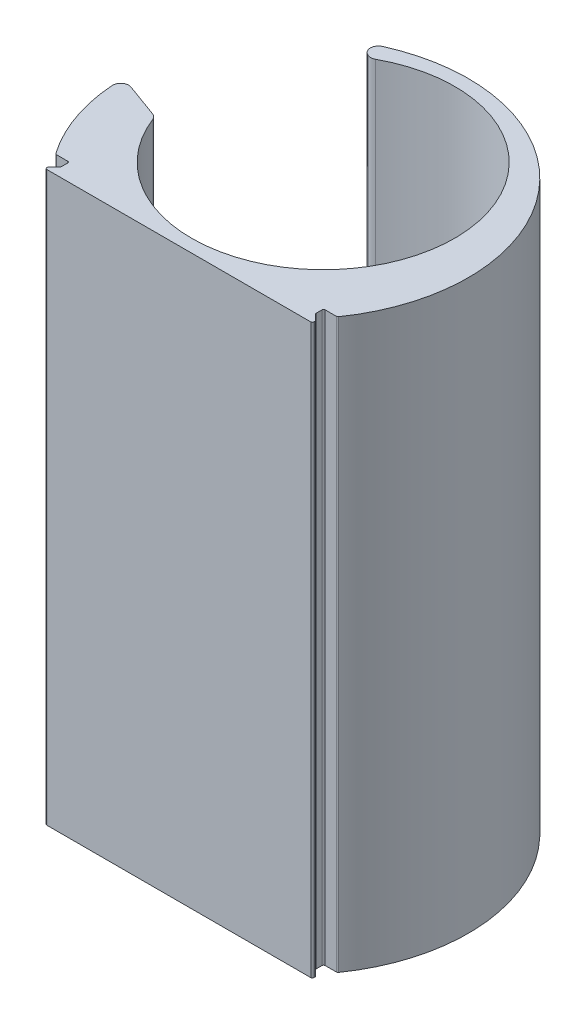
ISO-10303-21;
HEADER;
FILE_DESCRIPTION(('STEP AP214'),'2;1');
FILE_NAME('part.step','',(''),(''),'','','');
FILE_SCHEMA(('AUTOMOTIVE_DESIGN { 1 0 10303 214 1 1 1 1 }'));
ENDSEC;
DATA;
#1=APPLICATION_CONTEXT('core data for automotive mechanical design processes');
#2=APPLICATION_PROTOCOL_DEFINITION('international standard','automotive_design',2000,#1);
#3=PRODUCT_CONTEXT('',#1,'mechanical');
#4=PRODUCT('Part','Part','',(#3));
#5=PRODUCT_RELATED_PRODUCT_CATEGORY('part','',(#4));
#6=PRODUCT_DEFINITION_FORMATION('','',#4);
#7=PRODUCT_DEFINITION_CONTEXT('part definition',#1,'design');
#8=PRODUCT_DEFINITION('design','',#6,#7);
#9=PRODUCT_DEFINITION_SHAPE('','',#8);
#10=(LENGTH_UNIT() NAMED_UNIT(*) SI_UNIT(.MILLI.,.METRE.));
#11=(NAMED_UNIT(*) PLANE_ANGLE_UNIT() SI_UNIT($,.RADIAN.));
#12=(NAMED_UNIT(*) SI_UNIT($,.STERADIAN.) SOLID_ANGLE_UNIT());
#13=UNCERTAINTY_MEASURE_WITH_UNIT(LENGTH_MEASURE(1.E-05),#10,'distance_accuracy_value','');
#14=(GEOMETRIC_REPRESENTATION_CONTEXT(3) GLOBAL_UNCERTAINTY_ASSIGNED_CONTEXT((#13)) GLOBAL_UNIT_ASSIGNED_CONTEXT((#10,
#11,#12)) REPRESENTATION_CONTEXT('',''));
#15=CARTESIAN_POINT('',(0.,0.,0.));
#16=DIRECTION('',(0.,0.,1.));
#17=DIRECTION('',(1.,0.,0.));
#18=AXIS2_PLACEMENT_3D('',#15,#16,#17);
#19=CARTESIAN_POINT('',(-35.9484338432653,70.,15.2835908548455));
#20=DIRECTION('',(0.,-1.,0.));
#21=DIRECTION('',(0.,0.,-1.));
#22=AXIS2_PLACEMENT_3D('',#19,#20,#21);
#23=PLANE('',#22);
#24=DIRECTION('',(1.,0.,0.));
#25=VECTOR('',#24,1.);
#26=CARTESIAN_POINT('',(-18.3863018089094,70.,27.6860711877405));
#27=LINE('',#26,#25);
#28=CARTESIAN_POINT('',(-19.8984338432654,70.,27.6860711877405));
#29=VERTEX_POINT('',#28);
#30=CARTESIAN_POINT('',(-18.490213036857,70.,27.6860711877405));
#31=VERTEX_POINT('',#30);
#32=EDGE_CURVE('E416',#29,#31,#27,.T.);
#33=ORIENTED_EDGE('',*,*,#32,.T.);
#34=CARTESIAN_POINT('',(-18.490213036857,70.,27.4860711877405));
#35=DIRECTION('',(0.,-1.,0.));
#36=DIRECTION('',(0.,0.,-1.));
#37=AXIS2_PLACEMENT_3D('',#34,#35,#36);
#38=CIRCLE('',#37,0.2);
#39=CARTESIAN_POINT('',(-18.3262860809282,70.,27.6006484678616));
#40=VERTEX_POINT('',#39);
#41=EDGE_CURVE('E317',#31,#40,#38,.F.);
#42=ORIENTED_EDGE('',*,*,#41,.T.);
#43=CARTESIAN_POINT('',(-35.9484338432653,70.,15.2835908548455));
#44=DIRECTION('',(0.,1.,0.));
#45=DIRECTION('',(0.,0.,-1.));
#46=AXIS2_PLACEMENT_3D('',#43,#44,#45);
#47=CIRCLE('',#46,21.5);
#48=CARTESIAN_POINT('',(-44.7673259133943,70.,-4.32449784995735));
#49=VERTEX_POINT('',#48);
#50=EDGE_CURVE('E245',#40,#49,#47,.T.);
#51=ORIENTED_EDGE('',*,*,#50,.T.);
#52=CARTESIAN_POINT('',(-44.3571448868767,70.,-3.41249372415257));
#53=DIRECTION('',(0.,-1.,0.));
#54=DIRECTION('',(0.,0.,-1.));
#55=AXIS2_PLACEMENT_3D('',#52,#53,#54);
#56=CIRCLE('',#55,1.);
#57=CARTESIAN_POINT('',(-44.6991650302024,70.,-2.47280110336666));
#58=VERTEX_POINT('',#57);
#59=EDGE_CURVE('E235',#49,#58,#56,.F.);
#60=ORIENTED_EDGE('',*,*,#59,.T.);
#61=DIRECTION('',(-0.939692620785908,0.,-0.34202014332567));
#62=VECTOR('',#61,1.);
#63=CARTESIAN_POINT('',(-42.4335493384145,70.,-1.64818442926943));
#64=LINE('',#63,#62);
#65=CARTESIAN_POINT('',(-44.6276795017162,70.,-2.44678249881691));
#66=VERTEX_POINT('',#65);
#67=EDGE_CURVE('E437',#66,#58,#64,.T.);
#68=ORIENTED_EDGE('',*,*,#67,.F.);
#69=CARTESIAN_POINT('',(-44.2856593583906,70.,-3.38647511960282));
#70=DIRECTION('',(0.,-1.,0.));
#71=DIRECTION('',(0.,0.,-1.));
#72=AXIS2_PLACEMENT_3D('',#69,#70,#71);
#73=CIRCLE('',#72,1.);
#74=CARTESIAN_POINT('',(-43.8065084667167,70.,-2.50874257320378));
#75=VERTEX_POINT('',#74);
#76=EDGE_CURVE('E263',#66,#75,#73,.F.);
#77=ORIENTED_EDGE('',*,*,#76,.T.);
#78=CARTESIAN_POINT('',(-35.9484338432653,70.,11.8860711877405));
#79=DIRECTION('',(0.,1.,0.));
#80=DIRECTION('',(0.,0.,1.));
#81=AXIS2_PLACEMENT_3D('',#78,#79,#80);
#82=CIRCLE('',#81,16.4);
#83=CARTESIAN_POINT('',(-51.2208761714548,70.,17.8620652750976));
#84=VERTEX_POINT('',#83);
#85=EDGE_CURVE('E246',#84,#75,#82,.T.);
#86=ORIENTED_EDGE('',*,*,#85,.F.);
#87=CARTESIAN_POINT('',(-52.152122654881,70.,18.2264551584731));
#88=DIRECTION('',(0.,-1.,0.));
#89=DIRECTION('',(0.,0.,-1.));
#90=AXIS2_PLACEMENT_3D('',#87,#88,#89);
#91=CIRCLE('',#90,1.);
#92=CARTESIAN_POINT('',(-51.8101025115553,70.,17.2867625376872));
#93=VERTEX_POINT('',#92);
#94=EDGE_CURVE('E265',#84,#93,#91,.F.);
#95=ORIENTED_EDGE('',*,*,#94,.T.);
#96=DIRECTION('',(0.939692620785908,0.,0.342020143325669));
#97=VECTOR('',#96,1.);
#98=CARTESIAN_POINT('',(-49.6159723482535,70.,18.0853606072346));
#99=LINE('',#98,#97);
#100=CARTESIAN_POINT('',(-56.0587944961811,70.,15.7403651207179));
#101=VERTEX_POINT('',#100);
#102=EDGE_CURVE('E230',#101,#93,#99,.T.);
#103=ORIENTED_EDGE('',*,*,#102,.F.);
#104=CARTESIAN_POINT('',(-56.4008146395068,70.,16.6800577415038));
#105=DIRECTION('',(0.,-1.,0.));
#106=DIRECTION('',(0.,0.,-1.));
#107=AXIS2_PLACEMENT_3D('',#104,#105,#106);
#108=CIRCLE('',#107,1.);
#109=CARTESIAN_POINT('',(-57.3984917515186,70.,16.7481780774384));
#110=VERTEX_POINT('',#109);
#111=EDGE_CURVE('E224',#101,#110,#108,.F.);
#112=ORIENTED_EDGE('',*,*,#111,.T.);
#113=CARTESIAN_POINT('',(-53.5705816056024,70.,27.6006484678615));
#114=VERTEX_POINT('',#113);
#115=EDGE_CURVE('E227',#110,#114,#47,.T.);
#116=ORIENTED_EDGE('',*,*,#115,.T.);
#117=CARTESIAN_POINT('',(-53.4066546496737,70.,27.4860711877405));
#118=DIRECTION('',(0.,-1.,0.));
#119=DIRECTION('',(0.,0.,-1.));
#120=AXIS2_PLACEMENT_3D('',#117,#118,#119);
#121=CIRCLE('',#120,0.2);
#122=CARTESIAN_POINT('',(-53.4066546496737,70.,27.6860711877405));
#123=VERTEX_POINT('',#122);
#124=EDGE_CURVE('E307',#114,#123,#121,.F.);
#125=ORIENTED_EDGE('',*,*,#124,.T.);
#126=DIRECTION('',(1.,0.,0.));
#127=VECTOR('',#126,1.);
#128=CARTESIAN_POINT('',(-51.7984338432654,70.,27.6860711877405));
#129=LINE('',#128,#127);
#130=CARTESIAN_POINT('',(-51.9984338432654,70.,27.6860711877405));
#131=VERTEX_POINT('',#130);
#132=EDGE_CURVE('E393',#123,#131,#129,.T.);
#133=ORIENTED_EDGE('',*,*,#132,.T.);
#134=CARTESIAN_POINT('',(-51.9984338432654,70.,27.8860711877405));
#135=DIRECTION('',(0.,-1.,0.));
#136=DIRECTION('',(0.,0.,-1.));
#137=AXIS2_PLACEMENT_3D('',#134,#135,#136);
#138=CIRCLE('',#137,0.2);
#139=CARTESIAN_POINT('',(-51.7984338432654,70.,27.8860711877405));
#140=VERTEX_POINT('',#139);
#141=EDGE_CURVE('E11',#131,#140,#138,.T.);
#142=ORIENTED_EDGE('',*,*,#141,.T.);
#143=DIRECTION('',(0.,0.,1.));
#144=VECTOR('',#143,1.);
#145=CARTESIAN_POINT('',(-51.7984338432654,70.,28.6982032220964));
#146=LINE('',#145,#144);
#147=CARTESIAN_POINT('',(-51.7984338432654,70.,28.6153605096218));
#148=VERTEX_POINT('',#147);
#149=EDGE_CURVE('E391',#140,#148,#146,.T.);
#150=ORIENTED_EDGE('',*,*,#149,.T.);
#151=CARTESIAN_POINT('',(-51.9984338432654,70.,28.6153605096218));
#152=DIRECTION('',(0.,-1.,0.));
#153=DIRECTION('',(0.,0.,-1.));
#154=AXIS2_PLACEMENT_3D('',#151,#152,#153);
#155=CIRCLE('',#154,0.2);
#156=CARTESIAN_POINT('',(-51.857012487028,70.,28.7567818658591));
#157=VERTEX_POINT('',#156);
#158=EDGE_CURVE('E367',#148,#157,#155,.T.);
#159=ORIENTED_EDGE('',*,*,#158,.T.);
#160=DIRECTION('',(-0.707106781186547,0.,0.707106781186547));
#161=VECTOR('',#160,1.);
#162=CARTESIAN_POINT('',(-52.5984338432654,70.,29.4982032220964));
#163=LINE('',#162,#161);
#164=CARTESIAN_POINT('',(-52.5398551995027,70.,29.4396245783337));
#165=VERTEX_POINT('',#164);
#166=EDGE_CURVE('E397',#157,#165,#163,.T.);
#167=ORIENTED_EDGE('',*,*,#166,.T.);
#168=CARTESIAN_POINT('',(-52.3984338432654,70.,29.581045934571));
#169=DIRECTION('',(0.,-1.,0.));
#170=DIRECTION('',(0.,0.,-1.));
#171=AXIS2_PLACEMENT_3D('',#168,#169,#170);
#172=CIRCLE('',#171,0.2);
#173=CARTESIAN_POINT('',(-52.5984338432654,70.,29.581045934571));
#174=VERTEX_POINT('',#173);
#175=EDGE_CURVE('E309',#165,#174,#172,.F.);
#176=ORIENTED_EDGE('',*,*,#175,.T.);
#177=DIRECTION('',(0.,0.,1.));
#178=VECTOR('',#177,1.);
#179=CARTESIAN_POINT('',(-52.5984338432654,70.,29.8860711877405));
#180=LINE('',#179,#178);
#181=CARTESIAN_POINT('',(-52.5984338432654,70.,29.6860711877405));
#182=VERTEX_POINT('',#181);
#183=EDGE_CURVE('E400',#174,#182,#180,.T.);
#184=ORIENTED_EDGE('',*,*,#183,.T.);
#185=CARTESIAN_POINT('',(-52.3984338432654,70.,29.6860711877405));
#186=DIRECTION('',(0.,-1.,0.));
#187=DIRECTION('',(0.,0.,-1.));
#188=AXIS2_PLACEMENT_3D('',#185,#186,#187);
#189=CIRCLE('',#188,0.2);
#190=CARTESIAN_POINT('',(-52.3984338432654,70.,29.8860711877405));
#191=VERTEX_POINT('',#190);
#192=EDGE_CURVE('E311',#182,#191,#189,.F.);
#193=ORIENTED_EDGE('',*,*,#192,.T.);
#194=DIRECTION('',(1.,0.,0.));
#195=VECTOR('',#194,1.);
#196=CARTESIAN_POINT('',(-52.5984338432654,70.,29.8860711877405));
#197=LINE('',#196,#195);
#198=CARTESIAN_POINT('',(-19.4984338432653,70.,29.8860711877405));
#199=VERTEX_POINT('',#198);
#200=EDGE_CURVE('E406',#191,#199,#197,.T.);
#201=ORIENTED_EDGE('',*,*,#200,.T.);
#202=CARTESIAN_POINT('',(-19.4984338432653,70.,29.6860711877405));
#203=DIRECTION('',(0.,-1.,0.));
#204=DIRECTION('',(0.,0.,-1.));
#205=AXIS2_PLACEMENT_3D('',#202,#203,#204);
#206=CIRCLE('',#205,0.2);
#207=CARTESIAN_POINT('',(-19.2984338432653,70.,29.6860711877405));
#208=VERTEX_POINT('',#207);
#209=EDGE_CURVE('E313',#199,#208,#206,.F.);
#210=ORIENTED_EDGE('',*,*,#209,.T.);
#211=DIRECTION('',(0.,0.,-1.));
#212=VECTOR('',#211,1.);
#213=CARTESIAN_POINT('',(-19.2984338432653,70.,29.4982032220964));
#214=LINE('',#213,#212);
#215=CARTESIAN_POINT('',(-19.2984338432653,70.,29.5810459345711));
#216=VERTEX_POINT('',#215);
#217=EDGE_CURVE('E409',#208,#216,#214,.T.);
#218=ORIENTED_EDGE('',*,*,#217,.T.);
#219=CARTESIAN_POINT('',(-19.4984338432653,70.,29.5810459345711));
#220=DIRECTION('',(0.,-1.,0.));
#221=DIRECTION('',(0.,0.,-1.));
#222=AXIS2_PLACEMENT_3D('',#219,#220,#221);
#223=CIRCLE('',#222,0.2);
#224=CARTESIAN_POINT('',(-19.357012487028,70.,29.4396245783338));
#225=VERTEX_POINT('',#224);
#226=EDGE_CURVE('E315',#216,#225,#223,.F.);
#227=ORIENTED_EDGE('',*,*,#226,.T.);
#228=DIRECTION('',(-0.707106781186547,0.,-0.707106781186547));
#229=VECTOR('',#228,1.);
#230=CARTESIAN_POINT('',(-20.0984338432653,70.,28.6982032220964));
#231=LINE('',#230,#229);
#232=CARTESIAN_POINT('',(-20.0398551995027,70.,28.7567818658591));
#233=VERTEX_POINT('',#232);
#234=EDGE_CURVE('E412',#225,#233,#231,.T.);
#235=ORIENTED_EDGE('',*,*,#234,.T.);
#236=CARTESIAN_POINT('',(-19.8984338432654,70.,28.6153605096218));
#237=DIRECTION('',(0.,-1.,0.));
#238=DIRECTION('',(0.,0.,-1.));
#239=AXIS2_PLACEMENT_3D('',#236,#237,#238);
#240=CIRCLE('',#239,0.2);
#241=CARTESIAN_POINT('',(-20.0984338432653,70.,28.6153605096218));
#242=VERTEX_POINT('',#241);
#243=EDGE_CURVE('E60',#233,#242,#240,.T.);
#244=ORIENTED_EDGE('',*,*,#243,.T.);
#245=DIRECTION('',(0.,0.,-1.));
#246=VECTOR('',#245,1.);
#247=CARTESIAN_POINT('',(-20.0984338432653,70.,27.6860711877405));
#248=LINE('',#247,#246);
#249=CARTESIAN_POINT('',(-20.0984338432653,70.,27.8860711877405));
#250=VERTEX_POINT('',#249);
#251=EDGE_CURVE('E414',#242,#250,#248,.T.);
#252=ORIENTED_EDGE('',*,*,#251,.T.);
#253=CARTESIAN_POINT('',(-19.8984338432654,70.,27.8860711877405));
#254=DIRECTION('',(0.,-1.,0.));
#255=DIRECTION('',(0.,0.,-1.));
#256=AXIS2_PLACEMENT_3D('',#253,#254,#255);
#257=CIRCLE('',#256,0.2);
#258=EDGE_CURVE('E360',#250,#29,#257,.T.);
#259=ORIENTED_EDGE('',*,*,#258,.T.);
#260=EDGE_LOOP('',(#33,#42,#51,#60,#68,#77,#86,#95,#103,#112,#116,#125,#133,#142,#150,#159,#167,
#176,#184,#193,#201,#210,#218,#227,#235,#244,#252,#259));
#261=FACE_BOUND('',#260,.T.);
#262=ADVANCED_FACE('F38',(#261),#23,.F.);
#263=CARTESIAN_POINT('',(-35.9484338432653,70.,15.2835908548455));
#264=DIRECTION('',(0.,-1.,0.));
#265=DIRECTION('',(0.,0.,-1.));
#266=AXIS2_PLACEMENT_3D('',#263,#264,#265);
#267=CYLINDRICAL_SURFACE('',#266,21.5);
#268=ORIENTED_EDGE('',*,*,#50,.F.);
#269=DIRECTION('',(0.,-1.,0.));
#270=VECTOR('',#269,1.);
#271=CARTESIAN_POINT('',(-18.3262860809282,70.,27.6006484678616));
#272=LINE('',#271,#270);
#273=CARTESIAN_POINT('',(-18.3262860809282,-0.8,27.6006484678616));
#274=VERTEX_POINT('',#273);
#275=EDGE_CURVE('E287',#40,#274,#272,.T.);
#276=ORIENTED_EDGE('',*,*,#275,.T.);
#277=CARTESIAN_POINT('',(-35.9484338432653,-0.8,15.2835908548455));
#278=DIRECTION('',(0.,-1.,0.));
#279=DIRECTION('',(0.,0.,-1.));
#280=AXIS2_PLACEMENT_3D('',#277,#278,#279);
#281=CIRCLE('',#280,21.5);
#282=CARTESIAN_POINT('',(-53.5705816056024,-0.8,27.6006484678615));
#283=VERTEX_POINT('',#282);
#284=EDGE_CURVE('E449',#283,#274,#281,.T.);
#285=ORIENTED_EDGE('',*,*,#284,.F.);
#286=DIRECTION('',(0.,-1.,0.));
#287=VECTOR('',#286,1.);
#288=CARTESIAN_POINT('',(-53.5705816056024,70.,27.6006484678615));
#289=LINE('',#288,#287);
#290=EDGE_CURVE('E244',#283,#114,#289,.F.);
#291=ORIENTED_EDGE('',*,*,#290,.T.);
#292=ORIENTED_EDGE('',*,*,#115,.F.);
#293=DIRECTION('',(0.,-1.,0.));
#294=VECTOR('',#293,1.);
#295=CARTESIAN_POINT('',(-57.3984917515186,70.,16.7481780774384));
#296=LINE('',#295,#294);
#297=CARTESIAN_POINT('',(-57.3984917515186,6.00000000000001,16.7481780774384));
#298=VERTEX_POINT('',#297);
#299=EDGE_CURVE('E241',#110,#298,#296,.T.);
#300=ORIENTED_EDGE('',*,*,#299,.T.);
#301=CARTESIAN_POINT('',(-35.9484338432653,6.00000000000001,15.2835908548455));
#302=DIRECTION('',(0.,-1.,0.));
#303=DIRECTION('',(0.,0.,-1.));
#304=AXIS2_PLACEMENT_3D('',#301,#302,#303);
#305=CIRCLE('',#304,21.5);
#306=CARTESIAN_POINT('',(-44.7673259133943,6.00000000000001,-4.32449784995735));
#307=VERTEX_POINT('',#306);
#308=EDGE_CURVE('E447',#298,#307,#305,.T.);
#309=ORIENTED_EDGE('',*,*,#308,.T.);
#310=DIRECTION('',(0.,-1.,0.));
#311=VECTOR('',#310,1.);
#312=CARTESIAN_POINT('',(-44.7673259133943,70.,-4.32449784995735));
#313=LINE('',#312,#311);
#314=EDGE_CURVE('E252',#307,#49,#313,.F.);
#315=ORIENTED_EDGE('',*,*,#314,.T.);
#316=EDGE_LOOP('',(#268,#276,#285,#291,#292,#300,#309,#315));
#317=FACE_BOUND('',#316,.T.);
#318=ADVANCED_FACE('F240',(#317),#267,.T.);
#319=CARTESIAN_POINT('',(-51.7984338432654,70.,27.6860711877405));
#320=DIRECTION('',(0.,0.,-1.));
#321=DIRECTION('',(-1.,0.,0.));
#322=AXIS2_PLACEMENT_3D('',#319,#320,#321);
#323=PLANE('',#322);
#324=DIRECTION('',(-1.,0.,0.));
#325=VECTOR('',#324,1.);
#326=CARTESIAN_POINT('',(-51.7984338432654,-0.8,27.6860711877405));
#327=LINE('',#326,#325);
#328=CARTESIAN_POINT('',(-51.9984338432654,-0.8,27.6860711877405));
#329=VERTEX_POINT('',#328);
#330=CARTESIAN_POINT('',(-53.4066546496737,-0.8,27.6860711877405));
#331=VERTEX_POINT('',#330);
#332=EDGE_CURVE('E374',#329,#331,#327,.T.);
#333=ORIENTED_EDGE('',*,*,#332,.F.);
#334=DIRECTION('',(0.,-1.,0.));
#335=VECTOR('',#334,1.);
#336=CARTESIAN_POINT('',(-51.9984338432654,70.,27.6860711877405));
#337=LINE('',#336,#335);
#338=EDGE_CURVE('E356',#329,#131,#337,.F.);
#339=ORIENTED_EDGE('',*,*,#338,.T.);
#340=ORIENTED_EDGE('',*,*,#132,.F.);
#341=DIRECTION('',(0.,-1.,0.));
#342=VECTOR('',#341,1.);
#343=CARTESIAN_POINT('',(-53.4066546496737,70.,27.6860711877405));
#344=LINE('',#343,#342);
#345=EDGE_CURVE('E353',#123,#331,#344,.T.);
#346=ORIENTED_EDGE('',*,*,#345,.T.);
#347=EDGE_LOOP('',(#333,#339,#340,#346));
#348=FACE_BOUND('',#347,.T.);
#349=ADVANCED_FACE('F381',(#348),#323,.F.);
#350=CARTESIAN_POINT('',(-51.7984338432654,70.,28.6982032220964));
#351=DIRECTION('',(1.,0.,0.));
#352=DIRECTION('',(0.,0.,-1.));
#353=AXIS2_PLACEMENT_3D('',#350,#351,#352);
#354=PLANE('',#353);
#355=DIRECTION('',(0.,0.,-1.));
#356=VECTOR('',#355,1.);
#357=CARTESIAN_POINT('',(-51.7984338432654,-0.8,28.6982032220964));
#358=LINE('',#357,#356);
#359=CARTESIAN_POINT('',(-51.7984338432654,-0.8,28.6153605096218));
#360=VERTEX_POINT('',#359);
#361=CARTESIAN_POINT('',(-51.7984338432654,-0.8,27.8860711877405));
#362=VERTEX_POINT('',#361);
#363=EDGE_CURVE('E376',#360,#362,#358,.T.);
#364=ORIENTED_EDGE('',*,*,#363,.F.);
#365=DIRECTION('',(0.,-1.,0.));
#366=VECTOR('',#365,1.);
#367=CARTESIAN_POINT('',(-51.7984338432654,70.,28.6153605096218));
#368=LINE('',#367,#366);
#369=EDGE_CURVE('E351',#360,#148,#368,.F.);
#370=ORIENTED_EDGE('',*,*,#369,.T.);
#371=ORIENTED_EDGE('',*,*,#149,.F.);
#372=DIRECTION('',(0.,-1.,0.));
#373=VECTOR('',#372,1.);
#374=CARTESIAN_POINT('',(-51.7984338432654,-0.799999999999995,27.8860711877405));
#375=LINE('',#374,#373);
#376=EDGE_CURVE('E348',#140,#362,#375,.T.);
#377=ORIENTED_EDGE('',*,*,#376,.T.);
#378=EDGE_LOOP('',(#364,#370,#371,#377));
#379=FACE_BOUND('',#378,.T.);
#380=ADVANCED_FACE('F395',(#379),#354,.F.);
#381=CARTESIAN_POINT('',(-52.5984338432654,70.,29.4982032220964));
#382=DIRECTION('',(0.707106781186548,0.,0.707106781186548));
#383=DIRECTION('',(0.707106781186548,0.,-0.707106781186548));
#384=AXIS2_PLACEMENT_3D('',#381,#382,#383);
#385=PLANE('',#384);
#386=DIRECTION('',(0.707106781186547,0.,-0.707106781186547));
#387=VECTOR('',#386,1.);
#388=CARTESIAN_POINT('',(-52.5984338432654,-0.8,29.4982032220964));
#389=LINE('',#388,#387);
#390=CARTESIAN_POINT('',(-52.5398551995027,-0.8,29.4396245783337));
#391=VERTEX_POINT('',#390);
#392=CARTESIAN_POINT('',(-51.857012487028,-0.8,28.7567818658591));
#393=VERTEX_POINT('',#392);
#394=EDGE_CURVE('E469',#391,#393,#389,.T.);
#395=ORIENTED_EDGE('',*,*,#394,.F.);
#396=DIRECTION('',(0.,-1.,0.));
#397=VECTOR('',#396,1.);
#398=CARTESIAN_POINT('',(-52.5398551995027,70.,29.4396245783337));
#399=LINE('',#398,#397);
#400=EDGE_CURVE('E346',#391,#165,#399,.F.);
#401=ORIENTED_EDGE('',*,*,#400,.T.);
#402=ORIENTED_EDGE('',*,*,#166,.F.);
#403=DIRECTION('',(0.,-1.,0.));
#404=VECTOR('',#403,1.);
#405=CARTESIAN_POINT('',(-51.857012487028,-0.799999999999995,28.7567818658591));
#406=LINE('',#405,#404);
#407=EDGE_CURVE('E343',#157,#393,#406,.T.);
#408=ORIENTED_EDGE('',*,*,#407,.T.);
#409=EDGE_LOOP('',(#395,#401,#402,#408));
#410=FACE_BOUND('',#409,.T.);
#411=ADVANCED_FACE('F528',(#410),#385,.F.);
#412=CARTESIAN_POINT('',(-52.5984338432654,70.,29.8860711877405));
#413=DIRECTION('',(1.,0.,0.));
#414=DIRECTION('',(0.,0.,-1.));
#415=AXIS2_PLACEMENT_3D('',#412,#413,#414);
#416=PLANE('',#415);
#417=DIRECTION('',(0.,0.,-1.));
#418=VECTOR('',#417,1.);
#419=CARTESIAN_POINT('',(-52.5984338432654,-0.8,29.8860711877405));
#420=LINE('',#419,#418);
#421=CARTESIAN_POINT('',(-52.5984338432654,-0.8,29.6860711877405));
#422=VERTEX_POINT('',#421);
#423=CARTESIAN_POINT('',(-52.5984338432654,-0.8,29.581045934571));
#424=VERTEX_POINT('',#423);
#425=EDGE_CURVE('E466',#422,#424,#420,.T.);
#426=ORIENTED_EDGE('',*,*,#425,.F.);
#427=DIRECTION('',(0.,-1.,0.));
#428=VECTOR('',#427,1.);
#429=CARTESIAN_POINT('',(-52.5984338432654,70.,29.6860711877405));
#430=LINE('',#429,#428);
#431=EDGE_CURVE('E341',#422,#182,#430,.F.);
#432=ORIENTED_EDGE('',*,*,#431,.T.);
#433=ORIENTED_EDGE('',*,*,#183,.F.);
#434=DIRECTION('',(0.,-1.,0.));
#435=VECTOR('',#434,1.);
#436=CARTESIAN_POINT('',(-52.5984338432654,70.,29.581045934571));
#437=LINE('',#436,#435);
#438=EDGE_CURVE('E338',#174,#424,#437,.T.);
#439=ORIENTED_EDGE('',*,*,#438,.T.);
#440=EDGE_LOOP('',(#426,#432,#433,#439));
#441=FACE_BOUND('',#440,.T.);
#442=ADVANCED_FACE('F524',(#441),#416,.F.);
#443=CARTESIAN_POINT('',(-52.5984338432654,70.,29.8860711877405));
#444=DIRECTION('',(0.,0.,-1.));
#445=DIRECTION('',(-1.,0.,0.));
#446=AXIS2_PLACEMENT_3D('',#443,#444,#445);
#447=PLANE('',#446);
#448=DIRECTION('',(-1.,0.,0.));
#449=VECTOR('',#448,1.);
#450=CARTESIAN_POINT('',(-19.2984338432653,-0.8,29.8860711877405));
#451=LINE('',#450,#449);
#452=CARTESIAN_POINT('',(-19.4984338432653,-0.8,29.8860711877405));
#453=VERTEX_POINT('',#452);
#454=CARTESIAN_POINT('',(-52.3984338432654,-0.8,29.8860711877405));
#455=VERTEX_POINT('',#454);
#456=EDGE_CURVE('E463',#453,#455,#451,.T.);
#457=ORIENTED_EDGE('',*,*,#456,.F.);
#458=DIRECTION('',(0.,-1.,0.));
#459=VECTOR('',#458,1.);
#460=CARTESIAN_POINT('',(-19.4984338432653,70.,29.8860711877405));
#461=LINE('',#460,#459);
#462=EDGE_CURVE('E336',#453,#199,#461,.F.);
#463=ORIENTED_EDGE('',*,*,#462,.T.);
#464=ORIENTED_EDGE('',*,*,#200,.F.);
#465=DIRECTION('',(0.,-1.,0.));
#466=VECTOR('',#465,1.);
#467=CARTESIAN_POINT('',(-52.3984338432654,70.,29.8860711877405));
#468=LINE('',#467,#466);
#469=EDGE_CURVE('E333',#191,#455,#468,.T.);
#470=ORIENTED_EDGE('',*,*,#469,.T.);
#471=EDGE_LOOP('',(#457,#463,#464,#470));
#472=FACE_BOUND('',#471,.T.);
#473=ADVANCED_FACE('F520',(#472),#447,.F.);
#474=CARTESIAN_POINT('',(-19.2984338432653,70.,29.4982032220964));
#475=DIRECTION('',(-1.,0.,0.));
#476=DIRECTION('',(0.,0.,1.));
#477=AXIS2_PLACEMENT_3D('',#474,#475,#476);
#478=PLANE('',#477);
#479=DIRECTION('',(0.,0.,1.));
#480=VECTOR('',#479,1.);
#481=CARTESIAN_POINT('',(-19.2984338432653,-0.8,29.4982032220964));
#482=LINE('',#481,#480);
#483=CARTESIAN_POINT('',(-19.2984338432653,-0.8,29.5810459345711));
#484=VERTEX_POINT('',#483);
#485=CARTESIAN_POINT('',(-19.2984338432653,-0.8,29.6860711877405));
#486=VERTEX_POINT('',#485);
#487=EDGE_CURVE('E460',#484,#486,#482,.T.);
#488=ORIENTED_EDGE('',*,*,#487,.F.);
#489=DIRECTION('',(0.,-1.,0.));
#490=VECTOR('',#489,1.);
#491=CARTESIAN_POINT('',(-19.2984338432653,70.,29.5810459345711));
#492=LINE('',#491,#490);
#493=EDGE_CURVE('E331',#484,#216,#492,.F.);
#494=ORIENTED_EDGE('',*,*,#493,.T.);
#495=ORIENTED_EDGE('',*,*,#217,.F.);
#496=DIRECTION('',(0.,-1.,0.));
#497=VECTOR('',#496,1.);
#498=CARTESIAN_POINT('',(-19.2984338432653,70.,29.6860711877405));
#499=LINE('',#498,#497);
#500=EDGE_CURVE('E328',#208,#486,#499,.T.);
#501=ORIENTED_EDGE('',*,*,#500,.T.);
#502=EDGE_LOOP('',(#488,#494,#495,#501));
#503=FACE_BOUND('',#502,.T.);
#504=ADVANCED_FACE('F516',(#503),#478,.F.);
#505=CARTESIAN_POINT('',(-20.0984338432653,70.,28.6982032220964));
#506=DIRECTION('',(-0.707106781186548,0.,0.707106781186548));
#507=DIRECTION('',(0.707106781186548,0.,0.707106781186548));
#508=AXIS2_PLACEMENT_3D('',#505,#506,#507);
#509=PLANE('',#508);
#510=DIRECTION('',(0.707106781186547,0.,0.707106781186547));
#511=VECTOR('',#510,1.);
#512=CARTESIAN_POINT('',(-20.0984338432653,-0.8,28.6982032220964));
#513=LINE('',#512,#511);
#514=CARTESIAN_POINT('',(-20.0398551995027,-0.8,28.7567818658591));
#515=VERTEX_POINT('',#514);
#516=CARTESIAN_POINT('',(-19.357012487028,-0.8,29.4396245783338));
#517=VERTEX_POINT('',#516);
#518=EDGE_CURVE('E457',#515,#517,#513,.T.);
#519=ORIENTED_EDGE('',*,*,#518,.F.);
#520=DIRECTION('',(0.,-1.,0.));
#521=VECTOR('',#520,1.);
#522=CARTESIAN_POINT('',(-20.0398551995027,70.,28.7567818658591));
#523=LINE('',#522,#521);
#524=EDGE_CURVE('E326',#515,#233,#523,.F.);
#525=ORIENTED_EDGE('',*,*,#524,.T.);
#526=ORIENTED_EDGE('',*,*,#234,.F.);
#527=DIRECTION('',(0.,-1.,0.));
#528=VECTOR('',#527,1.);
#529=CARTESIAN_POINT('',(-19.357012487028,70.,29.4396245783338));
#530=LINE('',#529,#528);
#531=EDGE_CURVE('E323',#225,#517,#530,.T.);
#532=ORIENTED_EDGE('',*,*,#531,.T.);
#533=EDGE_LOOP('',(#519,#525,#526,#532));
#534=FACE_BOUND('',#533,.T.);
#535=ADVANCED_FACE('F513',(#534),#509,.F.);
#536=CARTESIAN_POINT('',(-20.0984338432653,70.,27.6860711877405));
#537=DIRECTION('',(-1.,0.,0.));
#538=DIRECTION('',(0.,0.,1.));
#539=AXIS2_PLACEMENT_3D('',#536,#537,#538);
#540=PLANE('',#539);
#541=DIRECTION('',(0.,0.,1.));
#542=VECTOR('',#541,1.);
#543=CARTESIAN_POINT('',(-20.0984338432653,-0.8,27.6860711877405));
#544=LINE('',#543,#542);
#545=CARTESIAN_POINT('',(-20.0984338432653,-0.8,27.8860711877405));
#546=VERTEX_POINT('',#545);
#547=CARTESIAN_POINT('',(-20.0984338432653,-0.8,28.6153605096218));
#548=VERTEX_POINT('',#547);
#549=EDGE_CURVE('E454',#546,#548,#544,.T.);
#550=ORIENTED_EDGE('',*,*,#549,.F.);
#551=DIRECTION('',(0.,-1.,0.));
#552=VECTOR('',#551,1.);
#553=CARTESIAN_POINT('',(-20.0984338432653,70.,27.8860711877405));
#554=LINE('',#553,#552);
#555=EDGE_CURVE('E53',#546,#250,#554,.F.);
#556=ORIENTED_EDGE('',*,*,#555,.T.);
#557=ORIENTED_EDGE('',*,*,#251,.F.);
#558=DIRECTION('',(0.,-1.,0.));
#559=VECTOR('',#558,1.);
#560=CARTESIAN_POINT('',(-20.0984338432653,-0.799999999999995,28.6153605096218));
#561=LINE('',#560,#559);
#562=EDGE_CURVE('E319',#242,#548,#561,.T.);
#563=ORIENTED_EDGE('',*,*,#562,.T.);
#564=EDGE_LOOP('',(#550,#556,#557,#563));
#565=FACE_BOUND('',#564,.T.);
#566=ADVANCED_FACE('F509',(#565),#540,.F.);
#567=CARTESIAN_POINT('',(-18.3863018089094,70.,27.6860711877405));
#568=DIRECTION('',(0.,0.,-1.));
#569=DIRECTION('',(-1.,0.,0.));
#570=AXIS2_PLACEMENT_3D('',#567,#568,#569);
#571=PLANE('',#570);
#572=DIRECTION('',(-1.,0.,0.));
#573=VECTOR('',#572,1.);
#574=CARTESIAN_POINT('',(-18.3863018089094,-0.8,27.6860711877405));
#575=LINE('',#574,#573);
#576=CARTESIAN_POINT('',(-18.490213036857,-0.8,27.6860711877405));
#577=VERTEX_POINT('',#576);
#578=CARTESIAN_POINT('',(-19.8984338432654,-0.8,27.6860711877405));
#579=VERTEX_POINT('',#578);
#580=EDGE_CURVE('E451',#577,#579,#575,.T.);
#581=ORIENTED_EDGE('',*,*,#580,.F.);
#582=DIRECTION('',(0.,-1.,0.));
#583=VECTOR('',#582,1.);
#584=CARTESIAN_POINT('',(-18.490213036857,70.,27.6860711877405));
#585=LINE('',#584,#583);
#586=EDGE_CURVE('E305',#577,#31,#585,.F.);
#587=ORIENTED_EDGE('',*,*,#586,.T.);
#588=ORIENTED_EDGE('',*,*,#32,.F.);
#589=DIRECTION('',(0.,-1.,0.));
#590=VECTOR('',#589,1.);
#591=CARTESIAN_POINT('',(-19.8984338432654,-0.799999999999995,27.6860711877405));
#592=LINE('',#591,#590);
#593=EDGE_CURVE('E302',#29,#579,#592,.T.);
#594=ORIENTED_EDGE('',*,*,#593,.T.);
#595=EDGE_LOOP('',(#581,#587,#588,#594));
#596=FACE_BOUND('',#595,.T.);
#597=ADVANCED_FACE('F506',(#596),#571,.F.);
#598=CARTESIAN_POINT('',(-35.9484338432653,70.,11.8860711877405));
#599=DIRECTION('',(0.,-1.,0.));
#600=DIRECTION('',(0.,0.,-1.));
#601=AXIS2_PLACEMENT_3D('',#598,#599,#600);
#602=CYLINDRICAL_SURFACE('',#601,16.4);
#603=CARTESIAN_POINT('',(-35.9484338432653,6.00000000000001,11.8860711877405));
#604=DIRECTION('',(0.,-1.,0.));
#605=DIRECTION('',(0.,0.,-1.));
#606=AXIS2_PLACEMENT_3D('',#603,#604,#605);
#607=CIRCLE('',#606,16.4);
#608=CARTESIAN_POINT('',(-51.2208761714548,6.00000000000001,17.8620652750976));
#609=VERTEX_POINT('',#608);
#610=CARTESIAN_POINT('',(-43.8065084667167,6.00000000000001,-2.50874257320378));
#611=VERTEX_POINT('',#610);
#612=EDGE_CURVE('E258',#609,#611,#607,.T.);
#613=ORIENTED_EDGE('',*,*,#612,.F.);
#614=DIRECTION('',(0.,-1.,0.));
#615=VECTOR('',#614,1.);
#616=CARTESIAN_POINT('',(-51.2208761714548,70.,17.8620652750976));
#617=LINE('',#616,#615);
#618=EDGE_CURVE('E275',#609,#84,#617,.F.);
#619=ORIENTED_EDGE('',*,*,#618,.T.);
#620=ORIENTED_EDGE('',*,*,#85,.T.);
#621=DIRECTION('',(0.,-1.,0.));
#622=VECTOR('',#621,1.);
#623=CARTESIAN_POINT('',(-43.8065084667167,70.,-2.50874257320378));
#624=LINE('',#623,#622);
#625=EDGE_CURVE('E272',#75,#611,#624,.T.);
#626=ORIENTED_EDGE('',*,*,#625,.T.);
#627=EDGE_LOOP('',(#613,#619,#620,#626));
#628=FACE_BOUND('',#627,.T.);
#629=CARTESIAN_POINT('',(-35.9484338432653,0.,11.8860711877405));
#630=DIRECTION('',(0.,1.,0.));
#631=DIRECTION('',(0.,0.,1.));
#632=AXIS2_PLACEMENT_3D('',#629,#630,#631);
#633=CIRCLE('',#632,16.4);
#634=CARTESIAN_POINT('',(-35.9484338432653,0.,28.2860711877405));
#635=VERTEX_POINT('',#634);
#636=EDGE_CURVE('E385',#635,#635,#633,.T.);
#637=ORIENTED_EDGE('',*,*,#636,.F.);
#638=EDGE_LOOP('',(#637));
#639=FACE_BOUND('',#638,.T.);
#640=ADVANCED_FACE('F427',(#628,#639),#602,.F.);
#641=CARTESIAN_POINT('',(-35.9484338432653,0.,15.2835908548455));
#642=DIRECTION('',(0.,-1.,0.));
#643=DIRECTION('',(0.,0.,-1.));
#644=AXIS2_PLACEMENT_3D('',#641,#642,#643);
#645=PLANE('',#644);
#646=ORIENTED_EDGE('',*,*,#636,.T.);
#647=EDGE_LOOP('',(#646));
#648=FACE_BOUND('',#647,.T.);
#649=ADVANCED_FACE('F550',(#648),#645,.F.);
#650=CARTESIAN_POINT('',(-35.9484338432653,-0.8,15.2835908548455));
#651=DIRECTION('',(0.,-1.,0.));
#652=DIRECTION('',(0.,0.,-1.));
#653=AXIS2_PLACEMENT_3D('',#650,#651,#652);
#654=PLANE('',#653);
#655=ORIENTED_EDGE('',*,*,#284,.T.);
#656=CARTESIAN_POINT('',(-18.490213036857,-0.799999999999995,27.4860711877405));
#657=DIRECTION('',(0.,-1.,0.));
#658=DIRECTION('',(0.,0.,-1.));
#659=AXIS2_PLACEMENT_3D('',#656,#657,#658);
#660=CIRCLE('',#659,0.2);
#661=EDGE_CURVE('E300',#274,#577,#660,.T.);
#662=ORIENTED_EDGE('',*,*,#661,.T.);
#663=ORIENTED_EDGE('',*,*,#580,.T.);
#664=CARTESIAN_POINT('',(-19.8984338432654,-0.799999999999995,27.8860711877405));
#665=DIRECTION('',(0.,-1.,0.));
#666=DIRECTION('',(0.,0.,-1.));
#667=AXIS2_PLACEMENT_3D('',#664,#665,#666);
#668=CIRCLE('',#667,0.2);
#669=EDGE_CURVE('E358',#579,#546,#668,.F.);
#670=ORIENTED_EDGE('',*,*,#669,.T.);
#671=ORIENTED_EDGE('',*,*,#549,.T.);
#672=CARTESIAN_POINT('',(-19.8984338432654,-0.799999999999995,28.6153605096218));
#673=DIRECTION('',(0.,-1.,0.));
#674=DIRECTION('',(0.,0.,-1.));
#675=AXIS2_PLACEMENT_3D('',#672,#673,#674);
#676=CIRCLE('',#675,0.2);
#677=EDGE_CURVE('E362',#548,#515,#676,.F.);
#678=ORIENTED_EDGE('',*,*,#677,.T.);
#679=ORIENTED_EDGE('',*,*,#518,.T.);
#680=CARTESIAN_POINT('',(-19.4984338432653,-0.799999999999995,29.5810459345711));
#681=DIRECTION('',(0.,-1.,0.));
#682=DIRECTION('',(0.,0.,-1.));
#683=AXIS2_PLACEMENT_3D('',#680,#681,#682);
#684=CIRCLE('',#683,0.2);
#685=EDGE_CURVE('E298',#517,#484,#684,.T.);
#686=ORIENTED_EDGE('',*,*,#685,.T.);
#687=ORIENTED_EDGE('',*,*,#487,.T.);
#688=CARTESIAN_POINT('',(-19.4984338432653,-0.799999999999995,29.6860711877405));
#689=DIRECTION('',(0.,-1.,0.));
#690=DIRECTION('',(0.,0.,-1.));
#691=AXIS2_PLACEMENT_3D('',#688,#689,#690);
#692=CIRCLE('',#691,0.2);
#693=EDGE_CURVE('E296',#486,#453,#692,.T.);
#694=ORIENTED_EDGE('',*,*,#693,.T.);
#695=ORIENTED_EDGE('',*,*,#456,.T.);
#696=CARTESIAN_POINT('',(-52.3984338432654,-0.799999999999995,29.6860711877405));
#697=DIRECTION('',(0.,-1.,0.));
#698=DIRECTION('',(0.,0.,-1.));
#699=AXIS2_PLACEMENT_3D('',#696,#697,#698);
#700=CIRCLE('',#699,0.2);
#701=EDGE_CURVE('E294',#455,#422,#700,.T.);
#702=ORIENTED_EDGE('',*,*,#701,.T.);
#703=ORIENTED_EDGE('',*,*,#425,.T.);
#704=CARTESIAN_POINT('',(-52.3984338432654,-0.799999999999995,29.581045934571));
#705=DIRECTION('',(0.,-1.,0.));
#706=DIRECTION('',(0.,0.,-1.));
#707=AXIS2_PLACEMENT_3D('',#704,#705,#706);
#708=CIRCLE('',#707,0.2);
#709=EDGE_CURVE('E292',#424,#391,#708,.T.);
#710=ORIENTED_EDGE('',*,*,#709,.T.);
#711=ORIENTED_EDGE('',*,*,#394,.T.);
#712=CARTESIAN_POINT('',(-51.9984338432654,-0.799999999999995,28.6153605096218));
#713=DIRECTION('',(0.,-1.,0.));
#714=DIRECTION('',(0.,0.,-1.));
#715=AXIS2_PLACEMENT_3D('',#712,#713,#714);
#716=CIRCLE('',#715,0.2);
#717=EDGE_CURVE('E365',#393,#360,#716,.F.);
#718=ORIENTED_EDGE('',*,*,#717,.T.);
#719=ORIENTED_EDGE('',*,*,#363,.T.);
#720=CARTESIAN_POINT('',(-51.9984338432654,-0.799999999999995,27.8860711877405));
#721=DIRECTION('',(0.,-1.,0.));
#722=DIRECTION('',(0.,0.,-1.));
#723=AXIS2_PLACEMENT_3D('',#720,#721,#722);
#724=CIRCLE('',#723,0.2);
#725=EDGE_CURVE('E46',#362,#329,#724,.F.);
#726=ORIENTED_EDGE('',*,*,#725,.T.);
#727=ORIENTED_EDGE('',*,*,#332,.T.);
#728=CARTESIAN_POINT('',(-53.4066546496737,-0.799999999999995,27.4860711877405));
#729=DIRECTION('',(0.,-1.,0.));
#730=DIRECTION('',(0.,0.,-1.));
#731=AXIS2_PLACEMENT_3D('',#728,#729,#730);
#732=CIRCLE('',#731,0.2);
#733=EDGE_CURVE('E290',#331,#283,#732,.T.);
#734=ORIENTED_EDGE('',*,*,#733,.T.);
#735=EDGE_LOOP('',(#655,#662,#663,#670,#671,#678,#679,#686,#687,#694,#695,#702,#703,#710,#711,
#718,#719,#726,#727,#734));
#736=FACE_BOUND('',#735,.T.);
#737=ADVANCED_FACE('F373',(#736),#654,.T.);
#738=CARTESIAN_POINT('',(-49.6159723482535,6.00000000000001,18.0853606072346));
#739=DIRECTION('',(-0.342020143325669,0.,0.939692620785908));
#740=DIRECTION('',(0.939692620785908,0.,0.342020143325669));
#741=AXIS2_PLACEMENT_3D('',#738,#739,#740);
#742=PLANE('',#741);
#743=DIRECTION('',(0.939692620785908,0.,0.342020143325669));
#744=VECTOR('',#743,1.);
#745=CARTESIAN_POINT('',(-49.6159723482535,6.00000000000001,18.0853606072346));
#746=LINE('',#745,#744);
#747=CARTESIAN_POINT('',(-56.0587944961811,6.00000000000001,15.7403651207179));
#748=VERTEX_POINT('',#747);
#749=CARTESIAN_POINT('',(-51.8101025115553,6.00000000000001,17.2867625376872));
#750=VERTEX_POINT('',#749);
#751=EDGE_CURVE('E441',#748,#750,#746,.T.);
#752=ORIENTED_EDGE('',*,*,#751,.F.);
#753=DIRECTION('',(0.,-1.,0.));
#754=VECTOR('',#753,1.);
#755=CARTESIAN_POINT('',(-56.0587944961811,6.00000000000001,15.7403651207179));
#756=LINE('',#755,#754);
#757=EDGE_CURVE('E255',#748,#101,#756,.F.);
#758=ORIENTED_EDGE('',*,*,#757,.T.);
#759=ORIENTED_EDGE('',*,*,#102,.T.);
#760=DIRECTION('',(0.,1.,0.));
#761=VECTOR('',#760,1.);
#762=CARTESIAN_POINT('',(-51.8101025115553,6.00000000000001,17.2867625376872));
#763=LINE('',#762,#761);
#764=EDGE_CURVE('E251',#93,#750,#763,.F.);
#765=ORIENTED_EDGE('',*,*,#764,.T.);
#766=EDGE_LOOP('',(#752,#758,#759,#765));
#767=FACE_BOUND('',#766,.T.);
#768=ADVANCED_FACE('F483',(#767),#742,.F.);
#769=CARTESIAN_POINT('',(-42.4335493384145,6.00000000000001,-1.64818442926943));
#770=DIRECTION('',(0.34202014332567,0.,-0.939692620785908));
#771=DIRECTION('',(-0.939692620785908,0.,-0.34202014332567));
#772=AXIS2_PLACEMENT_3D('',#769,#770,#771);
#773=PLANE('',#772);
#774=ORIENTED_EDGE('',*,*,#67,.T.);
#775=DIRECTION('',(0.,-1.,0.));
#776=VECTOR('',#775,1.);
#777=CARTESIAN_POINT('',(-44.6991650302024,6.00000000000001,-2.47280110336666));
#778=LINE('',#777,#776);
#779=CARTESIAN_POINT('',(-44.6991650302024,6.00000000000001,-2.47280110336666));
#780=VERTEX_POINT('',#779);
#781=EDGE_CURVE('E270',#58,#780,#778,.T.);
#782=ORIENTED_EDGE('',*,*,#781,.T.);
#783=DIRECTION('',(-0.939692620785908,0.,-0.34202014332567));
#784=VECTOR('',#783,1.);
#785=CARTESIAN_POINT('',(-42.4335493384145,6.00000000000001,-1.64818442926943));
#786=LINE('',#785,#784);
#787=CARTESIAN_POINT('',(-44.6276795017162,6.00000000000001,-2.44678249881691));
#788=VERTEX_POINT('',#787);
#789=EDGE_CURVE('E439',#788,#780,#786,.T.);
#790=ORIENTED_EDGE('',*,*,#789,.F.);
#791=DIRECTION('',(0.,1.,0.));
#792=VECTOR('',#791,1.);
#793=CARTESIAN_POINT('',(-44.6276795017162,70.,-2.44678249881691));
#794=LINE('',#793,#792);
#795=EDGE_CURVE('E234',#788,#66,#794,.T.);
#796=ORIENTED_EDGE('',*,*,#795,.T.);
#797=EDGE_LOOP('',(#774,#782,#790,#796));
#798=FACE_BOUND('',#797,.T.);
#799=ADVANCED_FACE('F436',(#798),#773,.F.);
#800=CARTESIAN_POINT('',(0.,6.00000000000001,0.));
#801=DIRECTION('',(0.,-1.,0.));
#802=DIRECTION('',(0.,0.,-1.));
#803=AXIS2_PLACEMENT_3D('',#800,#801,#802);
#804=PLANE('',#803);
#805=ORIENTED_EDGE('',*,*,#308,.F.);
#806=CARTESIAN_POINT('',(-56.4008146395068,6.00000000000001,16.6800577415038));
#807=DIRECTION('',(0.,-1.,0.));
#808=DIRECTION('',(0.,0.,-1.));
#809=AXIS2_PLACEMENT_3D('',#806,#807,#808);
#810=CIRCLE('',#809,1.);
#811=EDGE_CURVE('E250',#298,#748,#810,.T.);
#812=ORIENTED_EDGE('',*,*,#811,.T.);
#813=ORIENTED_EDGE('',*,*,#751,.T.);
#814=CARTESIAN_POINT('',(-52.152122654881,6.00000000000001,18.2264551584731));
#815=DIRECTION('',(0.,-1.,0.));
#816=DIRECTION('',(0.,0.,-1.));
#817=AXIS2_PLACEMENT_3D('',#814,#815,#816);
#818=CIRCLE('',#817,1.);
#819=EDGE_CURVE('E281',#750,#609,#818,.T.);
#820=ORIENTED_EDGE('',*,*,#819,.T.);
#821=ORIENTED_EDGE('',*,*,#612,.T.);
#822=CARTESIAN_POINT('',(-44.2856593583906,6.00000000000001,-3.38647511960282));
#823=DIRECTION('',(0.,-1.,0.));
#824=DIRECTION('',(0.,0.,-1.));
#825=AXIS2_PLACEMENT_3D('',#822,#823,#824);
#826=CIRCLE('',#825,1.);
#827=EDGE_CURVE('E284',#611,#788,#826,.T.);
#828=ORIENTED_EDGE('',*,*,#827,.T.);
#829=ORIENTED_EDGE('',*,*,#789,.T.);
#830=CARTESIAN_POINT('',(-44.3571448868767,6.00000000000001,-3.41249372415257));
#831=DIRECTION('',(0.,-1.,0.));
#832=DIRECTION('',(0.,0.,-1.));
#833=AXIS2_PLACEMENT_3D('',#830,#831,#832);
#834=CIRCLE('',#833,1.);
#835=EDGE_CURVE('E278',#780,#307,#834,.T.);
#836=ORIENTED_EDGE('',*,*,#835,.T.);
#837=EDGE_LOOP('',(#805,#812,#813,#820,#821,#828,#829,#836));
#838=FACE_BOUND('',#837,.T.);
#839=ADVANCED_FACE('F418',(#838),#804,.F.);
#840=CARTESIAN_POINT('',(-56.4008146395068,70.,16.6800577415038));
#841=DIRECTION('',(0.,-1.,0.));
#842=DIRECTION('',(0.,0.,-1.));
#843=AXIS2_PLACEMENT_3D('',#840,#841,#842);
#844=CYLINDRICAL_SURFACE('',#843,1.);
#845=ORIENTED_EDGE('',*,*,#111,.F.);
#846=ORIENTED_EDGE('',*,*,#757,.F.);
#847=ORIENTED_EDGE('',*,*,#811,.F.);
#848=ORIENTED_EDGE('',*,*,#299,.F.);
#849=EDGE_LOOP('',(#845,#846,#847,#848));
#850=FACE_BOUND('',#849,.T.);
#851=ADVANCED_FACE('F249',(#850),#844,.T.);
#852=CARTESIAN_POINT('',(-44.3571448868767,70.,-3.41249372415257));
#853=DIRECTION('',(0.,-1.,0.));
#854=DIRECTION('',(0.,0.,-1.));
#855=AXIS2_PLACEMENT_3D('',#852,#853,#854);
#856=CYLINDRICAL_SURFACE('',#855,1.);
#857=ORIENTED_EDGE('',*,*,#835,.F.);
#858=ORIENTED_EDGE('',*,*,#781,.F.);
#859=ORIENTED_EDGE('',*,*,#59,.F.);
#860=ORIENTED_EDGE('',*,*,#314,.F.);
#861=EDGE_LOOP('',(#857,#858,#859,#860));
#862=FACE_BOUND('',#861,.T.);
#863=ADVANCED_FACE('F480',(#862),#856,.T.);
#864=CARTESIAN_POINT('',(-52.152122654881,70.,18.2264551584731));
#865=DIRECTION('',(0.,-1.,0.));
#866=DIRECTION('',(0.,0.,-1.));
#867=AXIS2_PLACEMENT_3D('',#864,#865,#866);
#868=CYLINDRICAL_SURFACE('',#867,1.);
#869=ORIENTED_EDGE('',*,*,#94,.F.);
#870=ORIENTED_EDGE('',*,*,#618,.F.);
#871=ORIENTED_EDGE('',*,*,#819,.F.);
#872=ORIENTED_EDGE('',*,*,#764,.F.);
#873=EDGE_LOOP('',(#869,#870,#871,#872));
#874=FACE_BOUND('',#873,.T.);
#875=ADVANCED_FACE('F487',(#874),#868,.T.);
#876=CARTESIAN_POINT('',(-44.2856593583906,70.,-3.38647511960282));
#877=DIRECTION('',(0.,-1.,0.));
#878=DIRECTION('',(0.,0.,-1.));
#879=AXIS2_PLACEMENT_3D('',#876,#877,#878);
#880=CYLINDRICAL_SURFACE('',#879,1.);
#881=ORIENTED_EDGE('',*,*,#827,.F.);
#882=ORIENTED_EDGE('',*,*,#625,.F.);
#883=ORIENTED_EDGE('',*,*,#76,.F.);
#884=ORIENTED_EDGE('',*,*,#795,.F.);
#885=EDGE_LOOP('',(#881,#882,#883,#884));
#886=FACE_BOUND('',#885,.T.);
#887=ADVANCED_FACE('F432',(#886),#880,.T.);
#888=CARTESIAN_POINT('',(-18.490213036857,70.,27.4860711877405));
#889=DIRECTION('',(0.,-1.,0.));
#890=DIRECTION('',(0.,0.,-1.));
#891=AXIS2_PLACEMENT_3D('',#888,#889,#890);
#892=CYLINDRICAL_SURFACE('',#891,0.2);
#893=ORIENTED_EDGE('',*,*,#41,.F.);
#894=ORIENTED_EDGE('',*,*,#586,.F.);
#895=ORIENTED_EDGE('',*,*,#661,.F.);
#896=ORIENTED_EDGE('',*,*,#275,.F.);
#897=EDGE_LOOP('',(#893,#894,#895,#896));
#898=FACE_BOUND('',#897,.T.);
#899=ADVANCED_FACE('F494',(#898),#892,.T.);
#900=CARTESIAN_POINT('',(-19.8984338432654,70.,27.8860711877405));
#901=DIRECTION('',(0.,1.,0.));
#902=DIRECTION('',(0.,0.,1.));
#903=AXIS2_PLACEMENT_3D('',#900,#901,#902);
#904=CYLINDRICAL_SURFACE('',#903,0.2);
#905=ORIENTED_EDGE('',*,*,#258,.F.);
#906=ORIENTED_EDGE('',*,*,#555,.F.);
#907=ORIENTED_EDGE('',*,*,#669,.F.);
#908=ORIENTED_EDGE('',*,*,#593,.F.);
#909=EDGE_LOOP('',(#905,#906,#907,#908));
#910=FACE_BOUND('',#909,.T.);
#911=ADVANCED_FACE('F606',(#910),#904,.F.);
#912=CARTESIAN_POINT('',(-19.8984338432654,70.,28.6153605096218));
#913=DIRECTION('',(0.,1.,0.));
#914=DIRECTION('',(0.,0.,1.));
#915=AXIS2_PLACEMENT_3D('',#912,#913,#914);
#916=CYLINDRICAL_SURFACE('',#915,0.2);
#917=ORIENTED_EDGE('',*,*,#243,.F.);
#918=ORIENTED_EDGE('',*,*,#524,.F.);
#919=ORIENTED_EDGE('',*,*,#677,.F.);
#920=ORIENTED_EDGE('',*,*,#562,.F.);
#921=EDGE_LOOP('',(#917,#918,#919,#920));
#922=FACE_BOUND('',#921,.T.);
#923=ADVANCED_FACE('F616',(#922),#916,.F.);
#924=CARTESIAN_POINT('',(-19.4984338432653,70.,29.5810459345711));
#925=DIRECTION('',(0.,-1.,0.));
#926=DIRECTION('',(0.,0.,-1.));
#927=AXIS2_PLACEMENT_3D('',#924,#925,#926);
#928=CYLINDRICAL_SURFACE('',#927,0.2);
#929=ORIENTED_EDGE('',*,*,#226,.F.);
#930=ORIENTED_EDGE('',*,*,#493,.F.);
#931=ORIENTED_EDGE('',*,*,#685,.F.);
#932=ORIENTED_EDGE('',*,*,#531,.F.);
#933=EDGE_LOOP('',(#929,#930,#931,#932));
#934=FACE_BOUND('',#933,.T.);
#935=ADVANCED_FACE('F626',(#934),#928,.T.);
#936=CARTESIAN_POINT('',(-19.4984338432653,70.,29.6860711877405));
#937=DIRECTION('',(0.,-1.,0.));
#938=DIRECTION('',(0.,0.,-1.));
#939=AXIS2_PLACEMENT_3D('',#936,#937,#938);
#940=CYLINDRICAL_SURFACE('',#939,0.2);
#941=ORIENTED_EDGE('',*,*,#209,.F.);
#942=ORIENTED_EDGE('',*,*,#462,.F.);
#943=ORIENTED_EDGE('',*,*,#693,.F.);
#944=ORIENTED_EDGE('',*,*,#500,.F.);
#945=EDGE_LOOP('',(#941,#942,#943,#944));
#946=FACE_BOUND('',#945,.T.);
#947=ADVANCED_FACE('F636',(#946),#940,.T.);
#948=CARTESIAN_POINT('',(-52.3984338432654,70.,29.6860711877405));
#949=DIRECTION('',(0.,-1.,0.));
#950=DIRECTION('',(0.,0.,-1.));
#951=AXIS2_PLACEMENT_3D('',#948,#949,#950);
#952=CYLINDRICAL_SURFACE('',#951,0.2);
#953=ORIENTED_EDGE('',*,*,#192,.F.);
#954=ORIENTED_EDGE('',*,*,#431,.F.);
#955=ORIENTED_EDGE('',*,*,#701,.F.);
#956=ORIENTED_EDGE('',*,*,#469,.F.);
#957=EDGE_LOOP('',(#953,#954,#955,#956));
#958=FACE_BOUND('',#957,.T.);
#959=ADVANCED_FACE('F646',(#958),#952,.T.);
#960=CARTESIAN_POINT('',(-52.3984338432654,70.,29.581045934571));
#961=DIRECTION('',(0.,-1.,0.));
#962=DIRECTION('',(0.,0.,-1.));
#963=AXIS2_PLACEMENT_3D('',#960,#961,#962);
#964=CYLINDRICAL_SURFACE('',#963,0.2);
#965=ORIENTED_EDGE('',*,*,#175,.F.);
#966=ORIENTED_EDGE('',*,*,#400,.F.);
#967=ORIENTED_EDGE('',*,*,#709,.F.);
#968=ORIENTED_EDGE('',*,*,#438,.F.);
#969=EDGE_LOOP('',(#965,#966,#967,#968));
#970=FACE_BOUND('',#969,.T.);
#971=ADVANCED_FACE('F656',(#970),#964,.T.);
#972=CARTESIAN_POINT('',(-51.9984338432654,70.,28.6153605096218));
#973=DIRECTION('',(0.,1.,0.));
#974=DIRECTION('',(0.,0.,1.));
#975=AXIS2_PLACEMENT_3D('',#972,#973,#974);
#976=CYLINDRICAL_SURFACE('',#975,0.2);
#977=ORIENTED_EDGE('',*,*,#158,.F.);
#978=ORIENTED_EDGE('',*,*,#369,.F.);
#979=ORIENTED_EDGE('',*,*,#717,.F.);
#980=ORIENTED_EDGE('',*,*,#407,.F.);
#981=EDGE_LOOP('',(#977,#978,#979,#980));
#982=FACE_BOUND('',#981,.T.);
#983=ADVANCED_FACE('F666',(#982),#976,.F.);
#984=CARTESIAN_POINT('',(-51.9984338432654,70.,27.8860711877405));
#985=DIRECTION('',(0.,1.,0.));
#986=DIRECTION('',(0.,0.,1.));
#987=AXIS2_PLACEMENT_3D('',#984,#985,#986);
#988=CYLINDRICAL_SURFACE('',#987,0.2);
#989=ORIENTED_EDGE('',*,*,#141,.F.);
#990=ORIENTED_EDGE('',*,*,#338,.F.);
#991=ORIENTED_EDGE('',*,*,#725,.F.);
#992=ORIENTED_EDGE('',*,*,#376,.F.);
#993=EDGE_LOOP('',(#989,#990,#991,#992));
#994=FACE_BOUND('',#993,.T.);
#995=ADVANCED_FACE('F388',(#994),#988,.F.);
#996=CARTESIAN_POINT('',(-53.4066546496737,70.,27.4860711877405));
#997=DIRECTION('',(0.,-1.,0.));
#998=DIRECTION('',(0.,0.,-1.));
#999=AXIS2_PLACEMENT_3D('',#996,#997,#998);
#1000=CYLINDRICAL_SURFACE('',#999,0.2);
#1001=ORIENTED_EDGE('',*,*,#124,.F.);
#1002=ORIENTED_EDGE('',*,*,#290,.F.);
#1003=ORIENTED_EDGE('',*,*,#733,.F.);
#1004=ORIENTED_EDGE('',*,*,#345,.F.);
#1005=EDGE_LOOP('',(#1001,#1002,#1003,#1004));
#1006=FACE_BOUND('',#1005,.T.);
#1007=ADVANCED_FACE('F40',(#1006),#1000,.T.);
#1008=CLOSED_SHELL('',(#262,#318,#349,#380,#411,#442,#473,#504,#535,#566,#597,#640,#649,#737,
#768,#799,#839,#851,#863,#875,#887,#899,#911,#923,#935,#947,#959,#971,#983,#995,#1007));
#1009=MANIFOLD_SOLID_BREP('B2',#1008);
#1010=ADVANCED_BREP_SHAPE_REPRESENTATION('',(#18,#1009),#14);
#1011=SHAPE_DEFINITION_REPRESENTATION(#9,#1010);
ENDSEC;
END-ISO-10303-21;
